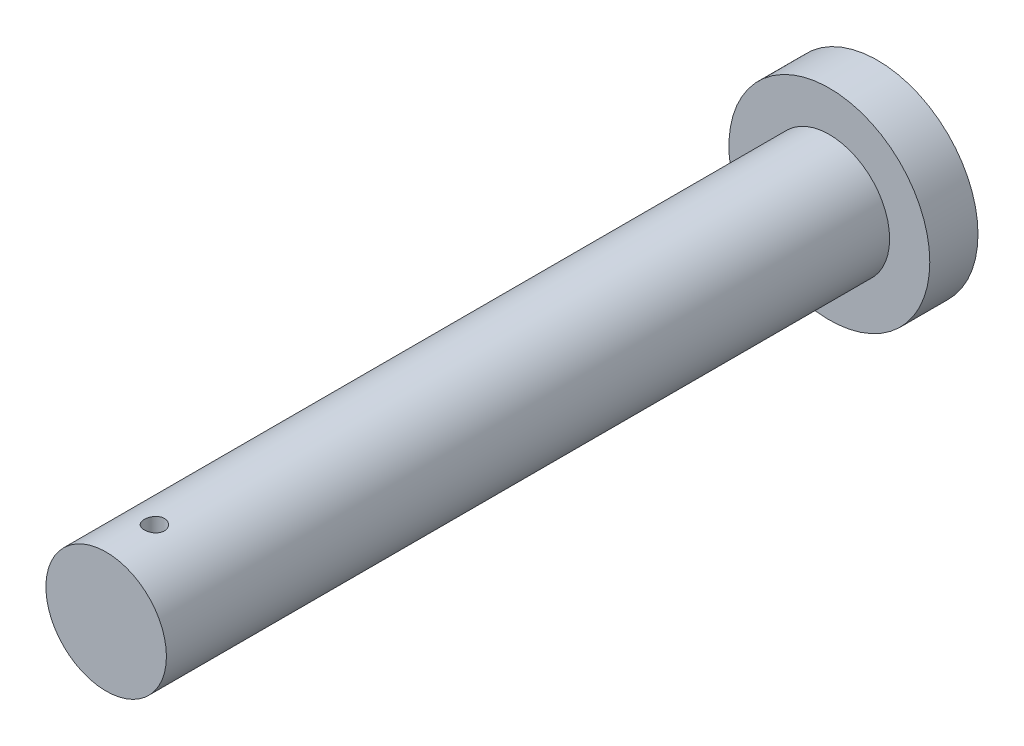
ISO-10303-21;
HEADER;
FILE_DESCRIPTION(('STEP AP214'),'2;1');
FILE_NAME('part.step','',(''),(''),'','','');
FILE_SCHEMA(('AUTOMOTIVE_DESIGN { 1 0 10303 214 1 1 1 1 }'));
ENDSEC;
DATA;
#1=APPLICATION_CONTEXT('core data for automotive mechanical design processes');
#2=APPLICATION_PROTOCOL_DEFINITION('international standard','automotive_design',2000,#1);
#3=PRODUCT_CONTEXT('',#1,'mechanical');
#4=PRODUCT('Part','Part','',(#3));
#5=PRODUCT_RELATED_PRODUCT_CATEGORY('part','',(#4));
#6=PRODUCT_DEFINITION_FORMATION('','',#4);
#7=PRODUCT_DEFINITION_CONTEXT('part definition',#1,'design');
#8=PRODUCT_DEFINITION('design','',#6,#7);
#9=PRODUCT_DEFINITION_SHAPE('','',#8);
#10=(LENGTH_UNIT() NAMED_UNIT(*) SI_UNIT(.MILLI.,.METRE.));
#11=(NAMED_UNIT(*) PLANE_ANGLE_UNIT() SI_UNIT($,.RADIAN.));
#12=(NAMED_UNIT(*) SI_UNIT($,.STERADIAN.) SOLID_ANGLE_UNIT());
#13=UNCERTAINTY_MEASURE_WITH_UNIT(LENGTH_MEASURE(1.E-05),#10,'distance_accuracy_value','');
#14=(GEOMETRIC_REPRESENTATION_CONTEXT(3) GLOBAL_UNCERTAINTY_ASSIGNED_CONTEXT((#13)) GLOBAL_UNIT_ASSIGNED_CONTEXT((#10,
#11,#12)) REPRESENTATION_CONTEXT('',''));
#15=CARTESIAN_POINT('',(0.,0.,0.));
#16=DIRECTION('',(0.,0.,1.));
#17=DIRECTION('',(1.,0.,0.));
#18=AXIS2_PLACEMENT_3D('',#15,#16,#17);
#19=CARTESIAN_POINT('',(0.,0.,12.));
#20=DIRECTION('',(0.,0.,-1.));
#21=DIRECTION('',(-1.,0.,0.));
#22=AXIS2_PLACEMENT_3D('',#19,#20,#21);
#23=CYLINDRICAL_SURFACE('',#22,25.);
#24=CARTESIAN_POINT('',(0.,0.,12.));
#25=DIRECTION('',(0.,0.,1.));
#26=DIRECTION('',(1.,0.,0.));
#27=AXIS2_PLACEMENT_3D('',#24,#25,#26);
#28=CIRCLE('',#27,25.);
#29=CARTESIAN_POINT('',(25.,0.,12.));
#30=VERTEX_POINT('',#29);
#31=EDGE_CURVE('E47',#30,#30,#28,.T.);
#32=ORIENTED_EDGE('',*,*,#31,.F.);
#33=EDGE_LOOP('',(#32));
#34=FACE_BOUND('',#33,.T.);
#35=CARTESIAN_POINT('',(0.,0.,0.));
#36=DIRECTION('',(0.,0.,1.));
#37=DIRECTION('',(1.,0.,0.));
#38=AXIS2_PLACEMENT_3D('',#35,#36,#37);
#39=CIRCLE('',#38,25.);
#40=CARTESIAN_POINT('',(25.,0.,0.));
#41=VERTEX_POINT('',#40);
#42=EDGE_CURVE('E52',#41,#41,#39,.T.);
#43=ORIENTED_EDGE('',*,*,#42,.T.);
#44=EDGE_LOOP('',(#43));
#45=FACE_BOUND('',#44,.T.);
#46=ADVANCED_FACE('F35',(#34,#45),#23,.T.);
#47=CARTESIAN_POINT('',(0.,0.,12.));
#48=DIRECTION('',(0.,0.,1.));
#49=DIRECTION('',(1.,0.,0.));
#50=AXIS2_PLACEMENT_3D('',#47,#48,#49);
#51=PLANE('',#50);
#52=CARTESIAN_POINT('',(0.,0.,12.));
#53=DIRECTION('',(0.,0.,1.));
#54=DIRECTION('',(1.,0.,0.));
#55=AXIS2_PLACEMENT_3D('',#52,#53,#54);
#56=CIRCLE('',#55,15.);
#57=CARTESIAN_POINT('',(15.,0.,12.));
#58=VERTEX_POINT('',#57);
#59=EDGE_CURVE('E10',#58,#58,#56,.T.);
#60=ORIENTED_EDGE('',*,*,#59,.F.);
#61=EDGE_LOOP('',(#60));
#62=FACE_BOUND('',#61,.T.);
#63=ORIENTED_EDGE('',*,*,#31,.T.);
#64=EDGE_LOOP('',(#63));
#65=FACE_BOUND('',#64,.T.);
#66=ADVANCED_FACE('F82',(#62,#65),#51,.T.);
#67=CARTESIAN_POINT('',(0.,0.,0.));
#68=DIRECTION('',(0.,0.,1.));
#69=DIRECTION('',(1.,0.,0.));
#70=AXIS2_PLACEMENT_3D('',#67,#68,#69);
#71=PLANE('',#70);
#72=ORIENTED_EDGE('',*,*,#42,.F.);
#73=EDGE_LOOP('',(#72));
#74=FACE_BOUND('',#73,.T.);
#75=ADVANCED_FACE('F78',(#74),#71,.F.);
#76=CARTESIAN_POINT('',(0.,0.,192.));
#77=DIRECTION('',(0.,0.,-1.));
#78=DIRECTION('',(-1.,0.,0.));
#79=AXIS2_PLACEMENT_3D('',#76,#77,#78);
#80=CYLINDRICAL_SURFACE('',#79,15.);
#81=CARTESIAN_POINT('',(0.,-15.,182.5));
#82=CARTESIAN_POINT('',(0.139390904958215,-14.9999976116882,182.499994411052));
#83=CARTESIAN_POINT('',(0.278857881838822,-14.9980367791303,182.488302725031));
#84=CARTESIAN_POINT('',(0.553880221673044,-14.9904034494139,182.441864341235));
#85=CARTESIAN_POINT('',(0.689431867959248,-14.9847275392389,182.407096443088));
#86=CARTESIAN_POINT('',(0.952604747212648,-14.9703006823645,182.315584551407));
#87=CARTESIAN_POINT('',(1.08023236843191,-14.9615522515919,182.258858534359));
#88=CARTESIAN_POINT('',(1.32414184197795,-14.9419422708207,182.125087707948));
#89=CARTESIAN_POINT('',(1.44042498987859,-14.9310809625443,182.048045222517));
#90=CARTESIAN_POINT('',(1.65947261429168,-14.9083331745831,181.87504491618));
#91=CARTESIAN_POINT('',(1.76211290353497,-14.8964387181486,181.778930885364));
#92=CARTESIAN_POINT('',(1.94988849865993,-14.8730262687673,181.570852031527));
#93=CARTESIAN_POINT('',(2.03502269939097,-14.8615082996267,181.458886208543));
#94=CARTESIAN_POINT('',(2.18586712560514,-14.8400756575978,181.221429033803));
#95=CARTESIAN_POINT('',(2.25145455286102,-14.8301712909164,181.095858663195));
#96=CARTESIAN_POINT('',(2.36055836541123,-14.8131978979467,180.835290435699));
#97=CARTESIAN_POINT('',(2.40407624156562,-14.8061286801431,180.700293216322));
#98=CARTESIAN_POINT('',(2.46741437778481,-14.7957053684276,180.426019725143));
#99=CARTESIAN_POINT('',(2.48744902913541,-14.792317684857,180.286794263499));
#100=CARTESIAN_POINT('',(2.50391672528988,-14.7895393893665,180.006919723117));
#101=CARTESIAN_POINT('',(2.500351440389,-14.7901484945721,179.866270745833));
#102=CARTESIAN_POINT('',(2.46989509839615,-14.7952642886356,179.589072138725));
#103=CARTESIAN_POINT('',(2.44324488188977,-14.7997307331892,179.452495196455));
#104=CARTESIAN_POINT('',(2.36775314040344,-14.8119949521101,179.185778682171));
#105=CARTESIAN_POINT('',(2.31891085431974,-14.8197928407327,179.055639331111));
#106=CARTESIAN_POINT('',(2.20017724609391,-14.837884793341,178.804771176559));
#107=CARTESIAN_POINT('',(2.13018591387971,-14.8481906710733,178.684090593919));
#108=CARTESIAN_POINT('',(1.97121201755743,-14.8701291841501,178.456095599462));
#109=CARTESIAN_POINT('',(1.88222792065428,-14.8817619265429,178.348782267545));
#110=CARTESIAN_POINT('',(1.68648221215905,-14.9052202787979,178.149173914193));
#111=CARTESIAN_POINT('',(1.57951396387311,-14.9170464923165,178.05708148146));
#112=CARTESIAN_POINT('',(1.35153524898163,-14.9394260139672,177.892122237335));
#113=CARTESIAN_POINT('',(1.23052469190641,-14.9499793138975,177.819255549817));
#114=CARTESIAN_POINT('',(0.977705916166699,-14.9686389289291,177.694797772864));
#115=CARTESIAN_POINT('',(0.84588872556465,-14.9767431840745,177.643224580669));
#116=CARTESIAN_POINT('',(0.575298345602724,-14.9895750301266,177.563005784754));
#117=CARTESIAN_POINT('',(0.436525739179464,-14.9943029035047,177.534358263026));
#118=CARTESIAN_POINT('',(0.157709901301624,-14.9998112984269,177.501078641539));
#119=CARTESIAN_POINT('',(0.0177007371510126,-15.0006375301278,177.496168428194));
#120=CARTESIAN_POINT('',(-0.261139772889885,-14.9983747442117,177.509761344428));
#121=CARTESIAN_POINT('',(-0.399971163892037,-14.9952858772412,177.528263573134));
#122=CARTESIAN_POINT('',(-0.67165617554676,-14.985568269382,177.587924849335));
#123=CARTESIAN_POINT('',(-0.804540868385375,-14.9789610480131,177.62894620839));
#124=CARTESIAN_POINT('',(-1.06154688486044,-14.9629446445536,177.7323345182));
#125=CARTESIAN_POINT('',(-1.18566771590971,-14.9535353051202,177.794702667635));
#126=CARTESIAN_POINT('',(-1.42283068946895,-14.9328451630241,177.939651124697));
#127=CARTESIAN_POINT('',(-1.53576525093714,-14.9215485588702,178.022405156167));
#128=CARTESIAN_POINT('',(-1.74624358550269,-14.898384673919,178.205537315385));
#129=CARTESIAN_POINT('',(-1.84378623969658,-14.8865173517155,178.305916723277));
#130=CARTESIAN_POINT('',(-2.021742779658,-14.8634017523585,178.522697548071));
#131=CARTESIAN_POINT('',(-2.10196876111371,-14.8521611613711,178.639254165514));
#132=CARTESIAN_POINT('',(-2.24170231029499,-14.8317152977788,178.884352969139));
#133=CARTESIAN_POINT('',(-2.30121053476983,-14.8225099606602,179.012894775227));
#134=CARTESIAN_POINT('',(-2.39753833147315,-14.807234536977,179.277789732812));
#135=CARTESIAN_POINT('',(-2.43445143254795,-14.8011515431106,179.414108095031));
#136=CARTESIAN_POINT('',(-2.48483545377828,-14.7927771683526,179.691120129222));
#137=CARTESIAN_POINT('',(-2.49830841194617,-14.7904854578272,179.831813419732));
#138=CARTESIAN_POINT('',(-2.50137286604736,-14.7899673308401,180.111705165962));
#139=CARTESIAN_POINT('',(-2.49126013612519,-14.7916905650565,180.250900378575));
#140=CARTESIAN_POINT('',(-2.44807983895685,-14.7988978145373,180.525579248051));
#141=CARTESIAN_POINT('',(-2.41501234611248,-14.8043818176121,180.661062916942));
#142=CARTESIAN_POINT('',(-2.3269744895949,-14.8184735628172,180.924358437293));
#143=CARTESIAN_POINT('',(-2.27202959060044,-14.8270776721967,181.052179010056));
#144=CARTESIAN_POINT('',(-2.1418270039159,-14.8464436892221,181.296835669195));
#145=CARTESIAN_POINT('',(-2.06656830874856,-14.857205703884,181.413671210372));
#146=CARTESIAN_POINT('',(-1.89681888437215,-14.8798345404562,181.634535583108));
#147=CARTESIAN_POINT('',(-1.80211056359365,-14.891712955763,181.7383960167));
#148=CARTESIAN_POINT('',(-1.59660903138024,-14.9151437236084,181.928851604475));
#149=CARTESIAN_POINT('',(-1.48581211291265,-14.9266960002655,182.015442768638));
#150=CARTESIAN_POINT('',(-1.25036916964029,-14.9482652964222,182.1694482682));
#151=CARTESIAN_POINT('',(-1.12563278753282,-14.958271162531,182.236726039313));
#152=CARTESIAN_POINT('',(-0.866513069378978,-14.9755116760178,182.34926948461));
#153=CARTESIAN_POINT('',(-0.732139494830006,-14.9827490817748,182.39455708108));
#154=CARTESIAN_POINT('',(-0.497703310045394,-14.9920579083296,182.452005274127));
#155=CARTESIAN_POINT('',(-0.399058830298442,-14.9950202727336,182.469974469616));
#156=CARTESIAN_POINT('',(-0.200289310319806,-14.9989921598612,182.493973737845));
#157=CARTESIAN_POINT('',(-0.100164295608493,-15.0000017162064,182.500004016137));
#158=CARTESIAN_POINT('',(0.,-15.,182.5));
#159=B_SPLINE_CURVE_WITH_KNOTS('',3,(#81,#82,#83,#84,#85,#86,#87,#88,#89,#90,#91,#92,#93,#94,
#95,#96,#97,#98,#99,#100,#101,#102,#103,#104,#105,#106,#107,#108,#109,#110,#111,#112,#113,#114,
#115,#116,#117,#118,#119,#120,#121,#122,#123,#124,#125,#126,#127,#128,#129,#130,#131,#132,#133,
#134,#135,#136,#137,#138,#139,#140,#141,#142,#143,#144,#145,#146,#147,#148,#149,#150,#151,#152,
#153,#154,#155,#156,#157,#158),.UNSPECIFIED.,.T.,.F.,(4,2,2,2,2,2,2,2,2,2,2,2,2,2,2,2,2,2,2,2,2,
2,2,2,2,2,2,2,2,2,2,2,2,2,2,2,2,2,4),(0.,0.417806584938512,0.83599754569542,1.25384686702528,
1.67164841267479,2.09302491062332,2.51442800169855,2.93842520823846,3.36239376876183,
3.78246077103426,4.20249804320889,4.61820521760411,5.03392665025382,5.45164556632559,
5.86939820680575,6.2923276991133,6.7152599163585,7.13854688915906,7.5617984452115,
7.98007883491398,8.3983431303586,8.81407807006416,9.22983635826068,9.64926825627024,
10.0687306305428,10.4925382200762,10.9163323737595,11.3383602234177,11.7603513778662,
12.177079095227,12.5938054618814,13.0100481822623,13.4263115502934,13.8475138419339,
14.2688133387897,14.693022316072,15.1168075213007,15.4170424816402,15.7172722727697),.UNSPECIFIED.);
#160=CARTESIAN_POINT('',(0.,-15.,182.5));
#161=VERTEX_POINT('',#160);
#162=EDGE_CURVE('E38',#161,#161,#159,.T.);
#163=ORIENTED_EDGE('',*,*,#162,.T.);
#164=EDGE_LOOP('',(#163));
#165=FACE_BOUND('',#164,.T.);
#166=CARTESIAN_POINT('',(0.,15.,182.5));
#167=CARTESIAN_POINT('',(-0.139390904958215,14.9999976116882,182.499994411052));
#168=CARTESIAN_POINT('',(-0.278857881838821,14.9980367791303,182.488302725031));
#169=CARTESIAN_POINT('',(-0.553880221673043,14.9904034494139,182.441864341235));
#170=CARTESIAN_POINT('',(-0.689431867959248,14.9847275392389,182.407096443088));
#171=CARTESIAN_POINT('',(-0.952604747212644,14.9703006823645,182.315584551407));
#172=CARTESIAN_POINT('',(-1.0802323684319,14.9615522515919,182.258858534359));
#173=CARTESIAN_POINT('',(-1.32414184197794,14.9419422708207,182.125087707948));
#174=CARTESIAN_POINT('',(-1.44042498987859,14.9310809625443,182.048045222517));
#175=CARTESIAN_POINT('',(-1.65947261429168,14.9083331745831,181.87504491618));
#176=CARTESIAN_POINT('',(-1.76211290353497,14.8964387181486,181.778930885364));
#177=CARTESIAN_POINT('',(-1.94988849865993,14.8730262687673,181.570852031527));
#178=CARTESIAN_POINT('',(-2.03502269939097,14.8615082996267,181.458886208543));
#179=CARTESIAN_POINT('',(-2.18586712560514,14.8400756575978,181.221429033803));
#180=CARTESIAN_POINT('',(-2.25145455286102,14.8301712909164,181.095858663195));
#181=CARTESIAN_POINT('',(-2.36055836541123,14.8131978979467,180.835290435699));
#182=CARTESIAN_POINT('',(-2.40407624156562,14.8061286801431,180.700293216322));
#183=CARTESIAN_POINT('',(-2.46741437778481,14.7957053684276,180.426019725143));
#184=CARTESIAN_POINT('',(-2.48744902913541,14.792317684857,180.286794263499));
#185=CARTESIAN_POINT('',(-2.50391672528988,14.7895393893665,180.006919723117));
#186=CARTESIAN_POINT('',(-2.500351440389,14.7901484945721,179.866270745833));
#187=CARTESIAN_POINT('',(-2.46989509839615,14.7952642886356,179.589072138725));
#188=CARTESIAN_POINT('',(-2.44324488188977,14.7997307331892,179.452495196455));
#189=CARTESIAN_POINT('',(-2.36775314040344,14.8119949521101,179.185778682171));
#190=CARTESIAN_POINT('',(-2.31891085431974,14.8197928407327,179.055639331111));
#191=CARTESIAN_POINT('',(-2.20017724609391,14.837884793341,178.804771176559));
#192=CARTESIAN_POINT('',(-2.13018591387971,14.8481906710733,178.684090593919));
#193=CARTESIAN_POINT('',(-1.97121201755743,14.8701291841501,178.456095599462));
#194=CARTESIAN_POINT('',(-1.88222792065428,14.8817619265429,178.348782267545));
#195=CARTESIAN_POINT('',(-1.68648221215906,14.9052202787979,178.149173914193));
#196=CARTESIAN_POINT('',(-1.57951396387314,14.9170464923165,178.05708148146));
#197=CARTESIAN_POINT('',(-1.35153524898167,14.9394260139672,177.892122237335));
#198=CARTESIAN_POINT('',(-1.23052469190645,14.9499793138974,177.819255549817));
#199=CARTESIAN_POINT('',(-0.977705916166735,14.9686389289291,177.694797772864));
#200=CARTESIAN_POINT('',(-0.845888725564681,14.9767431840745,177.643224580669));
#201=CARTESIAN_POINT('',(-0.575298345602744,14.9895750301266,177.563005784754));
#202=CARTESIAN_POINT('',(-0.436525739179476,14.9943029035047,177.534358263026));
#203=CARTESIAN_POINT('',(-0.157709901301627,14.9998112984269,177.501078641539));
#204=CARTESIAN_POINT('',(-0.0177007371510141,15.0006375301278,177.496168428194));
#205=CARTESIAN_POINT('',(0.261139772889886,14.9983747442117,177.509761344428));
#206=CARTESIAN_POINT('',(0.399971163892038,14.9952858772412,177.528263573134));
#207=CARTESIAN_POINT('',(0.671656175546761,14.985568269382,177.587924849335));
#208=CARTESIAN_POINT('',(0.804540868385374,14.9789610480131,177.62894620839));
#209=CARTESIAN_POINT('',(1.06154688486043,14.9629446445536,177.7323345182));
#210=CARTESIAN_POINT('',(1.18566771590971,14.9535353051202,177.794702667635));
#211=CARTESIAN_POINT('',(1.42283068946895,14.9328451630241,177.939651124697));
#212=CARTESIAN_POINT('',(1.53576525093714,14.9215485588702,178.022405156167));
#213=CARTESIAN_POINT('',(1.74624358550268,14.898384673919,178.205537315385));
#214=CARTESIAN_POINT('',(1.84378623969658,14.8865173517155,178.305916723277));
#215=CARTESIAN_POINT('',(2.021742779658,14.8634017523585,178.522697548071));
#216=CARTESIAN_POINT('',(2.10196876111371,14.8521611613711,178.639254165514));
#217=CARTESIAN_POINT('',(2.24170231029499,14.8317152977788,178.884352969139));
#218=CARTESIAN_POINT('',(2.30121053476983,14.8225099606602,179.012894775227));
#219=CARTESIAN_POINT('',(2.39753833147315,14.807234536977,179.277789732812));
#220=CARTESIAN_POINT('',(2.43445143254795,14.8011515431106,179.414108095031));
#221=CARTESIAN_POINT('',(2.48483545377828,14.7927771683526,179.691120129222));
#222=CARTESIAN_POINT('',(2.49830841194617,14.7904854578272,179.831813419732));
#223=CARTESIAN_POINT('',(2.50137286604736,14.7899673308401,180.111705165962));
#224=CARTESIAN_POINT('',(2.49126013612519,14.7916905650565,180.250900378575));
#225=CARTESIAN_POINT('',(2.44807983895685,14.7988978145373,180.525579248051));
#226=CARTESIAN_POINT('',(2.41501234611248,14.8043818176121,180.661062916942));
#227=CARTESIAN_POINT('',(2.3269744895949,14.8184735628172,180.924358437293));
#228=CARTESIAN_POINT('',(2.27202959060044,14.8270776721967,181.052179010056));
#229=CARTESIAN_POINT('',(2.1418270039159,14.8464436892221,181.296835669195));
#230=CARTESIAN_POINT('',(2.06656830874856,14.857205703884,181.413671210372));
#231=CARTESIAN_POINT('',(1.89681888437215,14.8798345404562,181.634535583108));
#232=CARTESIAN_POINT('',(1.80211056359365,14.891712955763,181.7383960167));
#233=CARTESIAN_POINT('',(1.59660903138024,14.9151437236084,181.928851604475));
#234=CARTESIAN_POINT('',(1.48581211291265,14.9266960002655,182.015442768638));
#235=CARTESIAN_POINT('',(1.25036916964029,14.9482652964222,182.1694482682));
#236=CARTESIAN_POINT('',(1.12563278753282,14.958271162531,182.236726039313));
#237=CARTESIAN_POINT('',(0.866513069378978,14.9755116760178,182.34926948461));
#238=CARTESIAN_POINT('',(0.732139494830006,14.9827490817748,182.39455708108));
#239=CARTESIAN_POINT('',(0.497703310045394,14.9920579083296,182.452005274127));
#240=CARTESIAN_POINT('',(0.399058830298442,14.9950202727336,182.469974469616));
#241=CARTESIAN_POINT('',(0.200289310319806,14.9989921598612,182.493973737845));
#242=CARTESIAN_POINT('',(0.100164295608493,15.0000017162064,182.500004016137));
#243=CARTESIAN_POINT('',(0.,15.,182.5));
#244=B_SPLINE_CURVE_WITH_KNOTS('',3,(#166,#167,#168,#169,#170,#171,#172,#173,#174,#175,#176,
#177,#178,#179,#180,#181,#182,#183,#184,#185,#186,#187,#188,#189,#190,#191,#192,#193,#194,#195,
#196,#197,#198,#199,#200,#201,#202,#203,#204,#205,#206,#207,#208,#209,#210,#211,#212,#213,#214,
#215,#216,#217,#218,#219,#220,#221,#222,#223,#224,#225,#226,#227,#228,#229,#230,#231,#232,#233,
#234,#235,#236,#237,#238,#239,#240,#241,#242,#243),.UNSPECIFIED.,.T.,.F.,(4,2,2,2,2,2,2,2,2,2,2,
2,2,2,2,2,2,2,2,2,2,2,2,2,2,2,2,2,2,2,2,2,2,2,2,2,2,2,4),(0.,0.417806584938511,
0.835997545695419,1.25384686702527,1.67164841267479,2.09302491062332,2.51442800169855,
2.93842520823846,3.36239376876183,3.78246077103426,4.20249804320889,4.61820521760411,
5.03392665025382,5.45164556632559,5.86939820680575,6.29232769911325,6.71525991635845,
7.13854688915902,7.56179844521149,7.98007883491398,8.3983431303586,8.81407807006415,
9.22983635826067,9.64926825627023,10.0687306305428,10.4925382200762,10.9163323737595,
11.3383602234177,11.7603513778662,12.177079095227,12.5938054618814,13.0100481822622,
13.4263115502934,13.8475138419339,14.2688133387897,14.693022316072,15.1168075213007,
15.4170424816402,15.7172722727697),.UNSPECIFIED.);
#245=CARTESIAN_POINT('',(0.,15.,182.5));
#246=VERTEX_POINT('',#245);
#247=EDGE_CURVE('E58',#246,#246,#244,.T.);
#248=ORIENTED_EDGE('',*,*,#247,.T.);
#249=EDGE_LOOP('',(#248));
#250=FACE_BOUND('',#249,.T.);
#251=CARTESIAN_POINT('',(0.,0.,192.));
#252=DIRECTION('',(0.,0.,1.));
#253=DIRECTION('',(1.,0.,0.));
#254=AXIS2_PLACEMENT_3D('',#251,#252,#253);
#255=CIRCLE('',#254,15.);
#256=CARTESIAN_POINT('',(15.,0.,192.));
#257=VERTEX_POINT('',#256);
#258=EDGE_CURVE('E55',#257,#257,#255,.T.);
#259=ORIENTED_EDGE('',*,*,#258,.F.);
#260=EDGE_LOOP('',(#259));
#261=FACE_BOUND('',#260,.T.);
#262=ORIENTED_EDGE('',*,*,#59,.T.);
#263=EDGE_LOOP('',(#262));
#264=FACE_BOUND('',#263,.T.);
#265=ADVANCED_FACE('F63',(#165,#250,#261,#264),#80,.T.);
#266=CARTESIAN_POINT('',(0.,0.,192.));
#267=DIRECTION('',(0.,0.,1.));
#268=DIRECTION('',(1.,0.,0.));
#269=AXIS2_PLACEMENT_3D('',#266,#267,#268);
#270=PLANE('',#269);
#271=ORIENTED_EDGE('',*,*,#258,.T.);
#272=EDGE_LOOP('',(#271));
#273=FACE_BOUND('',#272,.T.);
#274=ADVANCED_FACE('F70',(#273),#270,.T.);
#275=CARTESIAN_POINT('',(0.,-25.,180.));
#276=DIRECTION('',(0.,1.,0.));
#277=DIRECTION('',(0.,0.,1.));
#278=AXIS2_PLACEMENT_3D('',#275,#276,#277);
#279=CYLINDRICAL_SURFACE('',#278,2.5);
#280=ORIENTED_EDGE('',*,*,#247,.F.);
#281=EDGE_LOOP('',(#280));
#282=FACE_BOUND('',#281,.T.);
#283=ORIENTED_EDGE('',*,*,#162,.F.);
#284=EDGE_LOOP('',(#283));
#285=FACE_BOUND('',#284,.T.);
#286=ADVANCED_FACE('F67',(#282,#285),#279,.F.);
#287=CLOSED_SHELL('',(#46,#66,#75,#265,#274,#286));
#288=MANIFOLD_SOLID_BREP('B2',#287);
#289=ADVANCED_BREP_SHAPE_REPRESENTATION('',(#18,#288),#14);
#290=SHAPE_DEFINITION_REPRESENTATION(#9,#289);
ENDSEC;
END-ISO-10303-21;
